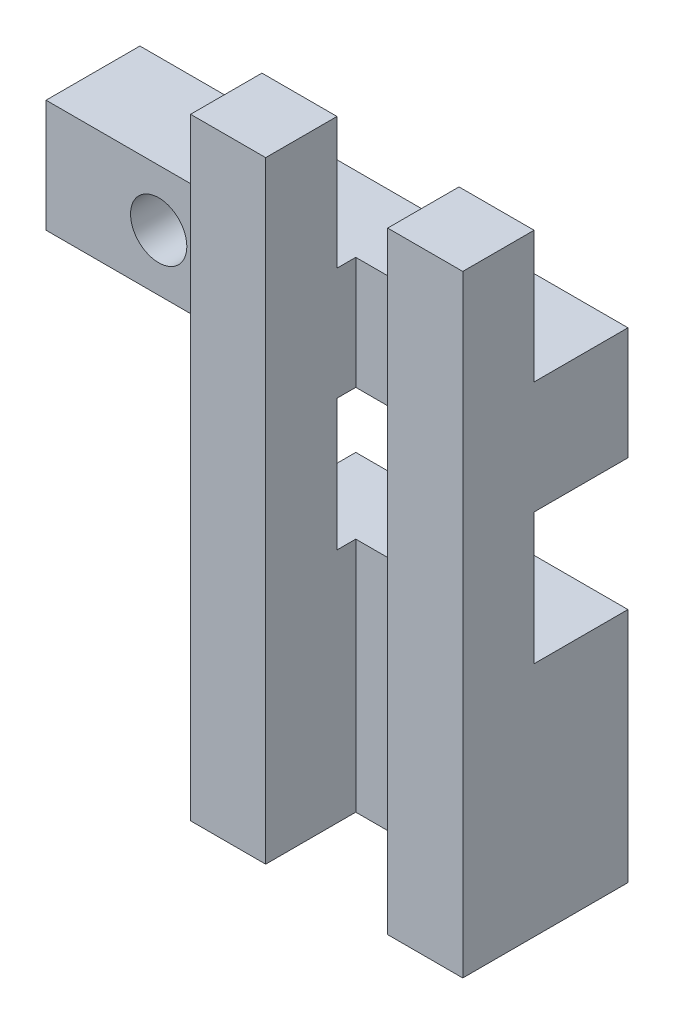
ISO-10303-21;
HEADER;
FILE_DESCRIPTION(('STEP AP214'),'2;1');
FILE_NAME('part.step','',(''),(''),'','','');
FILE_SCHEMA(('AUTOMOTIVE_DESIGN { 1 0 10303 214 1 1 1 1 }'));
ENDSEC;
DATA;
#1=APPLICATION_CONTEXT('core data for automotive mechanical design processes');
#2=APPLICATION_PROTOCOL_DEFINITION('international standard','automotive_design',2000,#1);
#3=PRODUCT_CONTEXT('',#1,'mechanical');
#4=PRODUCT('Part','Part','',(#3));
#5=PRODUCT_RELATED_PRODUCT_CATEGORY('part','',(#4));
#6=PRODUCT_DEFINITION_FORMATION('','',#4);
#7=PRODUCT_DEFINITION_CONTEXT('part definition',#1,'design');
#8=PRODUCT_DEFINITION('design','',#6,#7);
#9=PRODUCT_DEFINITION_SHAPE('','',#8);
#10=(LENGTH_UNIT() NAMED_UNIT(*) SI_UNIT(.MILLI.,.METRE.));
#11=(NAMED_UNIT(*) PLANE_ANGLE_UNIT() SI_UNIT($,.RADIAN.));
#12=(NAMED_UNIT(*) SI_UNIT($,.STERADIAN.) SOLID_ANGLE_UNIT());
#13=UNCERTAINTY_MEASURE_WITH_UNIT(LENGTH_MEASURE(1.E-05),#10,'distance_accuracy_value','');
#14=(GEOMETRIC_REPRESENTATION_CONTEXT(3) GLOBAL_UNCERTAINTY_ASSIGNED_CONTEXT((#13)) GLOBAL_UNIT_ASSIGNED_CONTEXT((#10,
#11,#12)) REPRESENTATION_CONTEXT('',''));
#15=CARTESIAN_POINT('',(0.,0.,0.));
#16=DIRECTION('',(0.,0.,1.));
#17=DIRECTION('',(1.,0.,0.));
#18=AXIS2_PLACEMENT_3D('',#15,#16,#17);
#19=CARTESIAN_POINT('',(0.,0.,5.));
#20=DIRECTION('',(0.,0.,-1.));
#21=DIRECTION('',(-1.,0.,0.));
#22=AXIS2_PLACEMENT_3D('',#19,#20,#21);
#23=PLANE('',#22);
#24=DIRECTION('',(0.,1.,0.));
#25=VECTOR('',#24,1.);
#26=CARTESIAN_POINT('',(26.,7.,5.));
#27=LINE('',#26,#25);
#28=CARTESIAN_POINT('',(26.,-13.,5.));
#29=VERTEX_POINT('',#28);
#30=CARTESIAN_POINT('',(26.,-6.,5.));
#31=VERTEX_POINT('',#30);
#32=EDGE_CURVE('E290',#29,#31,#27,.T.);
#33=ORIENTED_EDGE('',*,*,#32,.F.);
#34=DIRECTION('',(1.,0.,0.));
#35=VECTOR('',#34,1.);
#36=CARTESIAN_POINT('',(26.,-13.,5.));
#37=LINE('',#36,#35);
#38=CARTESIAN_POINT('',(22.,-13.,5.));
#39=VERTEX_POINT('',#38);
#40=EDGE_CURVE('E216',#39,#29,#37,.T.);
#41=ORIENTED_EDGE('',*,*,#40,.F.);
#42=DIRECTION('',(0.,-1.,0.));
#43=VECTOR('',#42,1.);
#44=CARTESIAN_POINT('',(22.,7.,5.));
#45=LINE('',#44,#43);
#46=CARTESIAN_POINT('',(22.,-6.,5.));
#47=VERTEX_POINT('',#46);
#48=EDGE_CURVE('E294',#47,#39,#45,.T.);
#49=ORIENTED_EDGE('',*,*,#48,.F.);
#50=DIRECTION('',(1.,0.,0.));
#51=VECTOR('',#50,1.);
#52=CARTESIAN_POINT('',(0.,-6.,5.));
#53=LINE('',#52,#51);
#54=EDGE_CURVE('E314',#47,#31,#53,.T.);
#55=ORIENTED_EDGE('',*,*,#54,.T.);
#56=EDGE_LOOP('',(#33,#41,#49,#55));
#57=FACE_BOUND('',#56,.T.);
#58=ADVANCED_FACE('F41',(#57),#23,.T.);
#59=CARTESIAN_POINT('',(0.,0.,5.));
#60=DIRECTION('',(0.,0.,-1.));
#61=DIRECTION('',(-1.,0.,0.));
#62=AXIS2_PLACEMENT_3D('',#59,#60,#61);
#63=PLANE('',#62);
#64=DIRECTION('',(0.,1.,0.));
#65=VECTOR('',#64,1.);
#66=CARTESIAN_POINT('',(15.5,7.,5.));
#67=LINE('',#66,#65);
#68=CARTESIAN_POINT('',(15.5,-13.,5.));
#69=VERTEX_POINT('',#68);
#70=CARTESIAN_POINT('',(15.5,-6.,5.));
#71=VERTEX_POINT('',#70);
#72=EDGE_CURVE('E269',#69,#71,#67,.T.);
#73=ORIENTED_EDGE('',*,*,#72,.F.);
#74=CARTESIAN_POINT('',(11.5,-13.,5.));
#75=VERTEX_POINT('',#74);
#76=EDGE_CURVE('E222',#75,#69,#37,.T.);
#77=ORIENTED_EDGE('',*,*,#76,.F.);
#78=DIRECTION('',(0.,-1.,0.));
#79=VECTOR('',#78,1.);
#80=CARTESIAN_POINT('',(11.5,7.,5.));
#81=LINE('',#80,#79);
#82=CARTESIAN_POINT('',(11.5,-6.,5.));
#83=VERTEX_POINT('',#82);
#84=EDGE_CURVE('E266',#83,#75,#81,.T.);
#85=ORIENTED_EDGE('',*,*,#84,.F.);
#86=DIRECTION('',(-1.,0.,0.));
#87=VECTOR('',#86,1.);
#88=CARTESIAN_POINT('',(0.,-6.,5.));
#89=LINE('',#88,#87);
#90=EDGE_CURVE('E64',#71,#83,#89,.T.);
#91=ORIENTED_EDGE('',*,*,#90,.F.);
#92=EDGE_LOOP('',(#73,#77,#85,#91));
#93=FACE_BOUND('',#92,.T.);
#94=ADVANCED_FACE('F400',(#93),#63,.T.);
#95=CARTESIAN_POINT('',(0.,0.,5.));
#96=DIRECTION('',(0.,0.,1.));
#97=DIRECTION('',(1.,0.,0.));
#98=AXIS2_PLACEMENT_3D('',#95,#96,#97);
#99=PLANE('',#98);
#100=CARTESIAN_POINT('',(6.,-3.,5.));
#101=DIRECTION('',(0.,0.,1.));
#102=DIRECTION('',(1.,0.,0.));
#103=AXIS2_PLACEMENT_3D('',#100,#101,#102);
#104=CIRCLE('',#103,1.5);
#105=CARTESIAN_POINT('',(7.5,-3.,5.));
#106=VERTEX_POINT('',#105);
#107=EDGE_CURVE('E305',#106,#106,#104,.T.);
#108=ORIENTED_EDGE('',*,*,#107,.F.);
#109=EDGE_LOOP('',(#108));
#110=FACE_BOUND('',#109,.T.);
#111=CARTESIAN_POINT('',(0.,-6.,5.));
#112=VERTEX_POINT('',#111);
#113=EDGE_CURVE('E316',#112,#83,#53,.T.);
#114=ORIENTED_EDGE('',*,*,#113,.T.);
#115=CARTESIAN_POINT('',(11.5,0.,5.));
#116=VERTEX_POINT('',#115);
#117=EDGE_CURVE('E265',#116,#83,#81,.T.);
#118=ORIENTED_EDGE('',*,*,#117,.F.);
#119=DIRECTION('',(-1.,0.,0.));
#120=VECTOR('',#119,1.);
#121=CARTESIAN_POINT('',(0.,0.,5.));
#122=LINE('',#121,#120);
#123=CARTESIAN_POINT('',(0.,0.,5.));
#124=VERTEX_POINT('',#123);
#125=EDGE_CURVE('E318',#116,#124,#122,.T.);
#126=ORIENTED_EDGE('',*,*,#125,.T.);
#127=DIRECTION('',(0.,-1.,0.));
#128=VECTOR('',#127,1.);
#129=CARTESIAN_POINT('',(0.,0.,5.));
#130=LINE('',#129,#128);
#131=EDGE_CURVE('E311',#124,#112,#130,.T.);
#132=ORIENTED_EDGE('',*,*,#131,.T.);
#133=EDGE_LOOP('',(#114,#118,#126,#132));
#134=FACE_BOUND('',#133,.T.);
#135=ADVANCED_FACE('F410',(#110,#134),#99,.T.);
#136=CARTESIAN_POINT('',(0.,0.,0.));
#137=DIRECTION('',(0.,0.,1.));
#138=DIRECTION('',(1.,0.,0.));
#139=AXIS2_PLACEMENT_3D('',#136,#137,#138);
#140=PLANE('',#139);
#141=DIRECTION('',(0.,-1.,0.));
#142=VECTOR('',#141,1.);
#143=CARTESIAN_POINT('',(0.,0.,0.));
#144=LINE('',#143,#142);
#145=CARTESIAN_POINT('',(0.,0.,0.));
#146=VERTEX_POINT('',#145);
#147=CARTESIAN_POINT('',(0.,-6.,0.));
#148=VERTEX_POINT('',#147);
#149=EDGE_CURVE('E308',#146,#148,#144,.T.);
#150=ORIENTED_EDGE('',*,*,#149,.F.);
#151=DIRECTION('',(-1.,0.,0.));
#152=VECTOR('',#151,1.);
#153=CARTESIAN_POINT('',(0.,0.,0.));
#154=LINE('',#153,#152);
#155=CARTESIAN_POINT('',(26.,0.,0.));
#156=VERTEX_POINT('',#155);
#157=EDGE_CURVE('E315',#156,#146,#154,.T.);
#158=ORIENTED_EDGE('',*,*,#157,.F.);
#159=DIRECTION('',(0.,1.,0.));
#160=VECTOR('',#159,1.);
#161=CARTESIAN_POINT('',(26.,0.,0.));
#162=LINE('',#161,#160);
#163=CARTESIAN_POINT('',(26.,-6.,0.));
#164=VERTEX_POINT('',#163);
#165=EDGE_CURVE('E328',#164,#156,#162,.T.);
#166=ORIENTED_EDGE('',*,*,#165,.F.);
#167=DIRECTION('',(1.,0.,0.));
#168=VECTOR('',#167,1.);
#169=CARTESIAN_POINT('',(0.,-6.,0.));
#170=LINE('',#169,#168);
#171=EDGE_CURVE('E326',#148,#164,#170,.T.);
#172=ORIENTED_EDGE('',*,*,#171,.F.);
#173=EDGE_LOOP('',(#150,#158,#166,#172));
#174=FACE_BOUND('',#173,.T.);
#175=CARTESIAN_POINT('',(6.,-3.,0.));
#176=DIRECTION('',(0.,0.,1.));
#177=DIRECTION('',(1.,0.,0.));
#178=AXIS2_PLACEMENT_3D('',#175,#176,#177);
#179=CIRCLE('',#178,1.5);
#180=CARTESIAN_POINT('',(7.5,-3.,0.));
#181=VERTEX_POINT('',#180);
#182=EDGE_CURVE('E304',#181,#181,#179,.T.);
#183=ORIENTED_EDGE('',*,*,#182,.T.);
#184=EDGE_LOOP('',(#183));
#185=FACE_BOUND('',#184,.T.);
#186=ADVANCED_FACE('F349',(#174,#185),#140,.F.);
#187=CARTESIAN_POINT('',(0.,0.,5.));
#188=DIRECTION('',(1.,0.,0.));
#189=DIRECTION('',(0.,1.,0.));
#190=AXIS2_PLACEMENT_3D('',#187,#188,#189);
#191=PLANE('',#190);
#192=ORIENTED_EDGE('',*,*,#149,.T.);
#193=DIRECTION('',(0.,0.,-1.));
#194=VECTOR('',#193,1.);
#195=CARTESIAN_POINT('',(0.,-6.,5.));
#196=LINE('',#195,#194);
#197=EDGE_CURVE('E49',#112,#148,#196,.T.);
#198=ORIENTED_EDGE('',*,*,#197,.F.);
#199=ORIENTED_EDGE('',*,*,#131,.F.);
#200=DIRECTION('',(0.,0.,-1.));
#201=VECTOR('',#200,1.);
#202=CARTESIAN_POINT('',(0.,0.,5.));
#203=LINE('',#202,#201);
#204=EDGE_CURVE('E322',#124,#146,#203,.T.);
#205=ORIENTED_EDGE('',*,*,#204,.T.);
#206=EDGE_LOOP('',(#192,#198,#199,#205));
#207=FACE_BOUND('',#206,.T.);
#208=ADVANCED_FACE('F43',(#207),#191,.F.);
#209=CARTESIAN_POINT('',(0.,-6.,5.));
#210=DIRECTION('',(0.,1.,0.));
#211=DIRECTION('',(0.,0.,1.));
#212=AXIS2_PLACEMENT_3D('',#209,#210,#211);
#213=PLANE('',#212);
#214=DIRECTION('',(1.,0.,0.));
#215=VECTOR('',#214,1.);
#216=CARTESIAN_POINT('',(15.5,-6.,4.));
#217=LINE('',#216,#215);
#218=CARTESIAN_POINT('',(15.5,-6.,4.));
#219=VERTEX_POINT('',#218);
#220=CARTESIAN_POINT('',(22.,-6.,4.));
#221=VERTEX_POINT('',#220);
#222=EDGE_CURVE('E238',#219,#221,#217,.T.);
#223=ORIENTED_EDGE('',*,*,#222,.F.);
#224=DIRECTION('',(0.,0.,1.));
#225=VECTOR('',#224,1.);
#226=CARTESIAN_POINT('',(15.5,-6.,4.));
#227=LINE('',#226,#225);
#228=EDGE_CURVE('E244',#219,#71,#227,.T.);
#229=ORIENTED_EDGE('',*,*,#228,.T.);
#230=ORIENTED_EDGE('',*,*,#90,.T.);
#231=ORIENTED_EDGE('',*,*,#113,.F.);
#232=ORIENTED_EDGE('',*,*,#197,.T.);
#233=ORIENTED_EDGE('',*,*,#171,.T.);
#234=DIRECTION('',(0.,0.,-1.));
#235=VECTOR('',#234,1.);
#236=CARTESIAN_POINT('',(26.,-6.,5.));
#237=LINE('',#236,#235);
#238=EDGE_CURVE('E336',#31,#164,#237,.T.);
#239=ORIENTED_EDGE('',*,*,#238,.F.);
#240=ORIENTED_EDGE('',*,*,#54,.F.);
#241=DIRECTION('',(0.,0.,1.));
#242=VECTOR('',#241,1.);
#243=CARTESIAN_POINT('',(22.,-6.,4.));
#244=LINE('',#243,#242);
#245=EDGE_CURVE('E245',#221,#47,#244,.T.);
#246=ORIENTED_EDGE('',*,*,#245,.F.);
#247=EDGE_LOOP('',(#223,#229,#230,#231,#232,#233,#239,#240,#246));
#248=FACE_BOUND('',#247,.T.);
#249=ADVANCED_FACE('F341',(#248),#213,.F.);
#250=CARTESIAN_POINT('',(26.,0.,5.));
#251=DIRECTION('',(-1.,0.,0.));
#252=DIRECTION('',(0.,0.,1.));
#253=AXIS2_PLACEMENT_3D('',#250,#251,#252);
#254=PLANE('',#253);
#255=ORIENTED_EDGE('',*,*,#165,.T.);
#256=DIRECTION('',(0.,0.,-1.));
#257=VECTOR('',#256,1.);
#258=CARTESIAN_POINT('',(26.,0.,5.));
#259=LINE('',#258,#257);
#260=CARTESIAN_POINT('',(26.,0.,5.));
#261=VERTEX_POINT('',#260);
#262=EDGE_CURVE('E333',#261,#156,#259,.T.);
#263=ORIENTED_EDGE('',*,*,#262,.F.);
#264=CARTESIAN_POINT('',(26.,7.,5.));
#265=VERTEX_POINT('',#264);
#266=EDGE_CURVE('E278',#261,#265,#27,.T.);
#267=ORIENTED_EDGE('',*,*,#266,.T.);
#268=DIRECTION('',(0.,0.,-1.));
#269=VECTOR('',#268,1.);
#270=CARTESIAN_POINT('',(26.,7.,8.8));
#271=LINE('',#270,#269);
#272=CARTESIAN_POINT('',(26.,7.,8.8));
#273=VERTEX_POINT('',#272);
#274=EDGE_CURVE('E301',#273,#265,#271,.T.);
#275=ORIENTED_EDGE('',*,*,#274,.F.);
#276=DIRECTION('',(0.,1.,0.));
#277=VECTOR('',#276,1.);
#278=CARTESIAN_POINT('',(26.,7.,8.8));
#279=LINE('',#278,#277);
#280=CARTESIAN_POINT('',(26.,-25.6,8.8));
#281=VERTEX_POINT('',#280);
#282=EDGE_CURVE('E279',#281,#273,#279,.T.);
#283=ORIENTED_EDGE('',*,*,#282,.F.);
#284=DIRECTION('',(0.,0.,-1.));
#285=VECTOR('',#284,1.);
#286=CARTESIAN_POINT('',(26.,-25.6,8.8));
#287=LINE('',#286,#285);
#288=CARTESIAN_POINT('',(26.,-25.6,0.));
#289=VERTEX_POINT('',#288);
#290=EDGE_CURVE('E289',#281,#289,#287,.T.);
#291=ORIENTED_EDGE('',*,*,#290,.T.);
#292=DIRECTION('',(0.,-1.,0.));
#293=VECTOR('',#292,1.);
#294=CARTESIAN_POINT('',(26.,-25.6,0.));
#295=LINE('',#294,#293);
#296=CARTESIAN_POINT('',(26.,-13.,0.));
#297=VERTEX_POINT('',#296);
#298=EDGE_CURVE('E218',#297,#289,#295,.T.);
#299=ORIENTED_EDGE('',*,*,#298,.F.);
#300=DIRECTION('',(0.,0.,1.));
#301=VECTOR('',#300,1.);
#302=CARTESIAN_POINT('',(26.,-13.,0.));
#303=LINE('',#302,#301);
#304=EDGE_CURVE('E229',#297,#29,#303,.T.);
#305=ORIENTED_EDGE('',*,*,#304,.T.);
#306=ORIENTED_EDGE('',*,*,#32,.T.);
#307=ORIENTED_EDGE('',*,*,#238,.T.);
#308=EDGE_LOOP('',(#255,#263,#267,#275,#283,#291,#299,#305,#306,#307));
#309=FACE_BOUND('',#308,.T.);
#310=ADVANCED_FACE('F353',(#309),#254,.F.);
#311=CARTESIAN_POINT('',(0.,0.,5.));
#312=DIRECTION('',(0.,-1.,0.));
#313=DIRECTION('',(0.,0.,-1.));
#314=AXIS2_PLACEMENT_3D('',#311,#312,#313);
#315=PLANE('',#314);
#316=CARTESIAN_POINT('',(15.5,0.,5.));
#317=VERTEX_POINT('',#316);
#318=EDGE_CURVE('E323',#317,#116,#122,.T.);
#319=ORIENTED_EDGE('',*,*,#318,.F.);
#320=DIRECTION('',(0.,0.,-1.));
#321=VECTOR('',#320,1.);
#322=CARTESIAN_POINT('',(15.5,0.,5.));
#323=LINE('',#322,#321);
#324=CARTESIAN_POINT('',(15.5,0.,4.));
#325=VERTEX_POINT('',#324);
#326=EDGE_CURVE('E247',#317,#325,#323,.T.);
#327=ORIENTED_EDGE('',*,*,#326,.T.);
#328=DIRECTION('',(-1.,0.,0.));
#329=VECTOR('',#328,1.);
#330=CARTESIAN_POINT('',(0.,0.,4.));
#331=LINE('',#330,#329);
#332=CARTESIAN_POINT('',(22.,0.,4.));
#333=VERTEX_POINT('',#332);
#334=EDGE_CURVE('E11',#333,#325,#331,.T.);
#335=ORIENTED_EDGE('',*,*,#334,.F.);
#336=DIRECTION('',(0.,0.,1.));
#337=VECTOR('',#336,1.);
#338=CARTESIAN_POINT('',(22.,0.,5.));
#339=LINE('',#338,#337);
#340=CARTESIAN_POINT('',(22.,0.,5.));
#341=VERTEX_POINT('',#340);
#342=EDGE_CURVE('E251',#333,#341,#339,.T.);
#343=ORIENTED_EDGE('',*,*,#342,.T.);
#344=EDGE_CURVE('E319',#261,#341,#122,.T.);
#345=ORIENTED_EDGE('',*,*,#344,.F.);
#346=ORIENTED_EDGE('',*,*,#262,.T.);
#347=ORIENTED_EDGE('',*,*,#157,.T.);
#348=ORIENTED_EDGE('',*,*,#204,.F.);
#349=ORIENTED_EDGE('',*,*,#125,.F.);
#350=EDGE_LOOP('',(#319,#327,#335,#343,#345,#346,#347,#348,#349));
#351=FACE_BOUND('',#350,.T.);
#352=ADVANCED_FACE('F357',(#351),#315,.F.);
#353=CARTESIAN_POINT('',(6.,-3.,5.));
#354=DIRECTION('',(0.,0.,-1.));
#355=DIRECTION('',(-1.,0.,0.));
#356=AXIS2_PLACEMENT_3D('',#353,#354,#355);
#357=CYLINDRICAL_SURFACE('',#356,1.5);
#358=ORIENTED_EDGE('',*,*,#107,.T.);
#359=EDGE_LOOP('',(#358));
#360=FACE_BOUND('',#359,.T.);
#361=ORIENTED_EDGE('',*,*,#182,.F.);
#362=EDGE_LOOP('',(#361));
#363=FACE_BOUND('',#362,.T.);
#364=ADVANCED_FACE('F458',(#360,#363),#357,.F.);
#365=CARTESIAN_POINT('',(26.,7.,8.8));
#366=DIRECTION('',(0.,-1.,0.));
#367=DIRECTION('',(1.,0.,0.));
#368=AXIS2_PLACEMENT_3D('',#365,#366,#367);
#369=PLANE('',#368);
#370=DIRECTION('',(-1.,0.,0.));
#371=VECTOR('',#370,1.);
#372=CARTESIAN_POINT('',(26.,7.,5.));
#373=LINE('',#372,#371);
#374=CARTESIAN_POINT('',(22.,7.,5.));
#375=VERTEX_POINT('',#374);
#376=EDGE_CURVE('E292',#265,#375,#373,.T.);
#377=ORIENTED_EDGE('',*,*,#376,.T.);
#378=DIRECTION('',(0.,0.,-1.));
#379=VECTOR('',#378,1.);
#380=CARTESIAN_POINT('',(22.,7.,8.8));
#381=LINE('',#380,#379);
#382=CARTESIAN_POINT('',(22.,7.,8.8));
#383=VERTEX_POINT('',#382);
#384=EDGE_CURVE('E298',#383,#375,#381,.T.);
#385=ORIENTED_EDGE('',*,*,#384,.F.);
#386=DIRECTION('',(-1.,0.,0.));
#387=VECTOR('',#386,1.);
#388=CARTESIAN_POINT('',(26.,7.,8.8));
#389=LINE('',#388,#387);
#390=EDGE_CURVE('E282',#273,#383,#389,.T.);
#391=ORIENTED_EDGE('',*,*,#390,.F.);
#392=ORIENTED_EDGE('',*,*,#274,.T.);
#393=EDGE_LOOP('',(#377,#385,#391,#392));
#394=FACE_BOUND('',#393,.T.);
#395=ADVANCED_FACE('F367',(#394),#369,.F.);
#396=CARTESIAN_POINT('',(22.,7.,8.8));
#397=DIRECTION('',(1.,0.,0.));
#398=DIRECTION('',(0.,1.,0.));
#399=AXIS2_PLACEMENT_3D('',#396,#397,#398);
#400=PLANE('',#399);
#401=EDGE_CURVE('E283',#375,#341,#45,.T.);
#402=ORIENTED_EDGE('',*,*,#401,.T.);
#403=ORIENTED_EDGE('',*,*,#342,.F.);
#404=DIRECTION('',(0.,1.,0.));
#405=VECTOR('',#404,1.);
#406=CARTESIAN_POINT('',(22.,0.499999999999992,4.));
#407=LINE('',#406,#405);
#408=EDGE_CURVE('E241',#221,#333,#407,.T.);
#409=ORIENTED_EDGE('',*,*,#408,.F.);
#410=ORIENTED_EDGE('',*,*,#245,.T.);
#411=ORIENTED_EDGE('',*,*,#48,.T.);
#412=DIRECTION('',(0.,0.,1.));
#413=VECTOR('',#412,1.);
#414=CARTESIAN_POINT('',(22.,-13.,4.));
#415=LINE('',#414,#413);
#416=CARTESIAN_POINT('',(22.,-13.,4.));
#417=VERTEX_POINT('',#416);
#418=EDGE_CURVE('E213',#417,#39,#415,.T.);
#419=ORIENTED_EDGE('',*,*,#418,.F.);
#420=DIRECTION('',(0.,1.,0.));
#421=VECTOR('',#420,1.);
#422=CARTESIAN_POINT('',(22.,-13.,4.));
#423=LINE('',#422,#421);
#424=CARTESIAN_POINT('',(22.,-25.6,4.));
#425=VERTEX_POINT('',#424);
#426=EDGE_CURVE('E56',#425,#417,#423,.T.);
#427=ORIENTED_EDGE('',*,*,#426,.F.);
#428=DIRECTION('',(0.,0.,-1.));
#429=VECTOR('',#428,1.);
#430=CARTESIAN_POINT('',(22.,-25.6,8.8));
#431=LINE('',#430,#429);
#432=CARTESIAN_POINT('',(22.,-25.6,8.8));
#433=VERTEX_POINT('',#432);
#434=EDGE_CURVE('E208',#433,#425,#431,.T.);
#435=ORIENTED_EDGE('',*,*,#434,.F.);
#436=DIRECTION('',(0.,-1.,0.));
#437=VECTOR('',#436,1.);
#438=CARTESIAN_POINT('',(22.,7.,8.8));
#439=LINE('',#438,#437);
#440=EDGE_CURVE('E285',#383,#433,#439,.T.);
#441=ORIENTED_EDGE('',*,*,#440,.F.);
#442=ORIENTED_EDGE('',*,*,#384,.T.);
#443=EDGE_LOOP('',(#402,#403,#409,#410,#411,#419,#427,#435,#441,#442));
#444=FACE_BOUND('',#443,.T.);
#445=ADVANCED_FACE('F390',(#444),#400,.F.);
#446=CARTESIAN_POINT('',(26.,-25.6,8.8));
#447=DIRECTION('',(0.,1.,0.));
#448=DIRECTION('',(0.,0.,1.));
#449=AXIS2_PLACEMENT_3D('',#446,#447,#448);
#450=PLANE('',#449);
#451=DIRECTION('',(1.,0.,0.));
#452=VECTOR('',#451,1.);
#453=CARTESIAN_POINT('',(15.5,-25.6,4.));
#454=LINE('',#453,#452);
#455=CARTESIAN_POINT('',(15.5,-25.6,4.));
#456=VERTEX_POINT('',#455);
#457=EDGE_CURVE('E200',#456,#425,#454,.T.);
#458=ORIENTED_EDGE('',*,*,#457,.F.);
#459=DIRECTION('',(0.,0.,-1.));
#460=VECTOR('',#459,1.);
#461=CARTESIAN_POINT('',(15.5,-25.6,8.8));
#462=LINE('',#461,#460);
#463=CARTESIAN_POINT('',(15.5,-25.6,8.8));
#464=VERTEX_POINT('',#463);
#465=EDGE_CURVE('E186',#464,#456,#462,.T.);
#466=ORIENTED_EDGE('',*,*,#465,.F.);
#467=DIRECTION('',(1.,0.,0.));
#468=VECTOR('',#467,1.);
#469=CARTESIAN_POINT('',(15.5,-25.6,8.8));
#470=LINE('',#469,#468);
#471=CARTESIAN_POINT('',(11.5,-25.6,8.8));
#472=VERTEX_POINT('',#471);
#473=EDGE_CURVE('E196',#472,#464,#470,.T.);
#474=ORIENTED_EDGE('',*,*,#473,.F.);
#475=DIRECTION('',(0.,0.,-1.));
#476=VECTOR('',#475,1.);
#477=CARTESIAN_POINT('',(11.5,-25.6,8.8));
#478=LINE('',#477,#476);
#479=CARTESIAN_POINT('',(11.5,-25.6,0.));
#480=VERTEX_POINT('',#479);
#481=EDGE_CURVE('E197',#472,#480,#478,.T.);
#482=ORIENTED_EDGE('',*,*,#481,.T.);
#483=DIRECTION('',(-1.,0.,0.));
#484=VECTOR('',#483,1.);
#485=CARTESIAN_POINT('',(26.,-25.6,0.));
#486=LINE('',#485,#484);
#487=EDGE_CURVE('E221',#289,#480,#486,.T.);
#488=ORIENTED_EDGE('',*,*,#487,.F.);
#489=ORIENTED_EDGE('',*,*,#290,.F.);
#490=DIRECTION('',(1.,0.,0.));
#491=VECTOR('',#490,1.);
#492=CARTESIAN_POINT('',(26.,-25.6,8.8));
#493=LINE('',#492,#491);
#494=EDGE_CURVE('E287',#433,#281,#493,.T.);
#495=ORIENTED_EDGE('',*,*,#494,.F.);
#496=ORIENTED_EDGE('',*,*,#434,.T.);
#497=EDGE_LOOP('',(#458,#466,#474,#482,#488,#489,#495,#496));
#498=FACE_BOUND('',#497,.T.);
#499=ADVANCED_FACE('F205',(#498),#450,.F.);
#500=CARTESIAN_POINT('',(0.,0.,8.8));
#501=DIRECTION('',(0.,0.,-1.));
#502=DIRECTION('',(-1.,0.,0.));
#503=AXIS2_PLACEMENT_3D('',#500,#501,#502);
#504=PLANE('',#503);
#505=ORIENTED_EDGE('',*,*,#282,.T.);
#506=ORIENTED_EDGE('',*,*,#390,.T.);
#507=ORIENTED_EDGE('',*,*,#440,.T.);
#508=ORIENTED_EDGE('',*,*,#494,.T.);
#509=EDGE_LOOP('',(#505,#506,#507,#508));
#510=FACE_BOUND('',#509,.T.);
#511=ADVANCED_FACE('F371',(#510),#504,.F.);
#512=ORIENTED_EDGE('',*,*,#266,.F.);
#513=ORIENTED_EDGE('',*,*,#344,.T.);
#514=ORIENTED_EDGE('',*,*,#401,.F.);
#515=ORIENTED_EDGE('',*,*,#376,.F.);
#516=EDGE_LOOP('',(#512,#513,#514,#515));
#517=FACE_BOUND('',#516,.T.);
#518=ADVANCED_FACE('F363',(#517),#23,.T.);
#519=ORIENTED_EDGE('',*,*,#318,.T.);
#520=CARTESIAN_POINT('',(11.5,7.,5.));
#521=VERTEX_POINT('',#520);
#522=EDGE_CURVE('E261',#521,#116,#81,.T.);
#523=ORIENTED_EDGE('',*,*,#522,.F.);
#524=DIRECTION('',(-1.,0.,0.));
#525=VECTOR('',#524,1.);
#526=CARTESIAN_POINT('',(15.5,7.,5.));
#527=LINE('',#526,#525);
#528=CARTESIAN_POINT('',(15.5,7.,5.));
#529=VERTEX_POINT('',#528);
#530=EDGE_CURVE('E264',#529,#521,#527,.T.);
#531=ORIENTED_EDGE('',*,*,#530,.F.);
#532=EDGE_CURVE('E268',#317,#529,#67,.T.);
#533=ORIENTED_EDGE('',*,*,#532,.F.);
#534=EDGE_LOOP('',(#519,#523,#531,#533));
#535=FACE_BOUND('',#534,.T.);
#536=ADVANCED_FACE('F413',(#535),#63,.T.);
#537=CARTESIAN_POINT('',(15.5,7.,8.8));
#538=DIRECTION('',(-1.,0.,0.));
#539=DIRECTION('',(0.,-1.,0.));
#540=AXIS2_PLACEMENT_3D('',#537,#538,#539);
#541=PLANE('',#540);
#542=ORIENTED_EDGE('',*,*,#465,.T.);
#543=DIRECTION('',(0.,-1.,0.));
#544=VECTOR('',#543,1.);
#545=CARTESIAN_POINT('',(15.5,-13.,4.));
#546=LINE('',#545,#544);
#547=CARTESIAN_POINT('',(15.5,-13.,4.));
#548=VERTEX_POINT('',#547);
#549=EDGE_CURVE('E189',#548,#456,#546,.T.);
#550=ORIENTED_EDGE('',*,*,#549,.F.);
#551=DIRECTION('',(0.,0.,1.));
#552=VECTOR('',#551,1.);
#553=CARTESIAN_POINT('',(15.5,-13.,4.));
#554=LINE('',#553,#552);
#555=EDGE_CURVE('E214',#548,#69,#554,.T.);
#556=ORIENTED_EDGE('',*,*,#555,.T.);
#557=ORIENTED_EDGE('',*,*,#72,.T.);
#558=ORIENTED_EDGE('',*,*,#228,.F.);
#559=DIRECTION('',(0.,-1.,0.));
#560=VECTOR('',#559,1.);
#561=CARTESIAN_POINT('',(15.5,0.499999999999992,4.));
#562=LINE('',#561,#560);
#563=EDGE_CURVE('E236',#325,#219,#562,.T.);
#564=ORIENTED_EDGE('',*,*,#563,.F.);
#565=ORIENTED_EDGE('',*,*,#326,.F.);
#566=ORIENTED_EDGE('',*,*,#532,.T.);
#567=DIRECTION('',(0.,0.,-1.));
#568=VECTOR('',#567,1.);
#569=CARTESIAN_POINT('',(15.5,7.,8.8));
#570=LINE('',#569,#568);
#571=CARTESIAN_POINT('',(15.5,7.,8.8));
#572=VERTEX_POINT('',#571);
#573=EDGE_CURVE('E254',#572,#529,#570,.T.);
#574=ORIENTED_EDGE('',*,*,#573,.F.);
#575=DIRECTION('',(0.,1.,0.));
#576=VECTOR('',#575,1.);
#577=CARTESIAN_POINT('',(15.5,7.,8.8));
#578=LINE('',#577,#576);
#579=EDGE_CURVE('E192',#464,#572,#578,.T.);
#580=ORIENTED_EDGE('',*,*,#579,.F.);
#581=EDGE_LOOP('',(#542,#550,#556,#557,#558,#564,#565,#566,#574,#580));
#582=FACE_BOUND('',#581,.T.);
#583=ADVANCED_FACE('F188',(#582),#541,.F.);
#584=CARTESIAN_POINT('',(15.5,7.,8.8));
#585=DIRECTION('',(0.,-1.,0.));
#586=DIRECTION('',(1.,0.,0.));
#587=AXIS2_PLACEMENT_3D('',#584,#585,#586);
#588=PLANE('',#587);
#589=ORIENTED_EDGE('',*,*,#530,.T.);
#590=DIRECTION('',(0.,0.,-1.));
#591=VECTOR('',#590,1.);
#592=CARTESIAN_POINT('',(11.5,7.,8.8));
#593=LINE('',#592,#591);
#594=CARTESIAN_POINT('',(11.5,7.,8.8));
#595=VERTEX_POINT('',#594);
#596=EDGE_CURVE('E257',#595,#521,#593,.T.);
#597=ORIENTED_EDGE('',*,*,#596,.F.);
#598=DIRECTION('',(-1.,0.,0.));
#599=VECTOR('',#598,1.);
#600=CARTESIAN_POINT('',(15.5,7.,8.8));
#601=LINE('',#600,#599);
#602=EDGE_CURVE('E274',#572,#595,#601,.T.);
#603=ORIENTED_EDGE('',*,*,#602,.F.);
#604=ORIENTED_EDGE('',*,*,#573,.T.);
#605=EDGE_LOOP('',(#589,#597,#603,#604));
#606=FACE_BOUND('',#605,.T.);
#607=ADVANCED_FACE('F417',(#606),#588,.F.);
#608=CARTESIAN_POINT('',(11.5,7.,8.8));
#609=DIRECTION('',(1.,0.,0.));
#610=DIRECTION('',(0.,1.,0.));
#611=AXIS2_PLACEMENT_3D('',#608,#609,#610);
#612=PLANE('',#611);
#613=ORIENTED_EDGE('',*,*,#522,.T.);
#614=ORIENTED_EDGE('',*,*,#117,.T.);
#615=ORIENTED_EDGE('',*,*,#84,.T.);
#616=DIRECTION('',(0.,0.,1.));
#617=VECTOR('',#616,1.);
#618=CARTESIAN_POINT('',(11.5,-13.,0.));
#619=LINE('',#618,#617);
#620=CARTESIAN_POINT('',(11.5,-13.,0.));
#621=VERTEX_POINT('',#620);
#622=EDGE_CURVE('E234',#621,#75,#619,.T.);
#623=ORIENTED_EDGE('',*,*,#622,.F.);
#624=DIRECTION('',(0.,1.,0.));
#625=VECTOR('',#624,1.);
#626=CARTESIAN_POINT('',(11.5,-25.6,0.));
#627=LINE('',#626,#625);
#628=EDGE_CURVE('E225',#480,#621,#627,.T.);
#629=ORIENTED_EDGE('',*,*,#628,.F.);
#630=ORIENTED_EDGE('',*,*,#481,.F.);
#631=DIRECTION('',(0.,-1.,0.));
#632=VECTOR('',#631,1.);
#633=CARTESIAN_POINT('',(11.5,7.,8.8));
#634=LINE('',#633,#632);
#635=EDGE_CURVE('E272',#595,#472,#634,.T.);
#636=ORIENTED_EDGE('',*,*,#635,.F.);
#637=ORIENTED_EDGE('',*,*,#596,.T.);
#638=EDGE_LOOP('',(#613,#614,#615,#623,#629,#630,#636,#637));
#639=FACE_BOUND('',#638,.T.);
#640=ADVANCED_FACE('F406',(#639),#612,.F.);
#641=CARTESIAN_POINT('',(0.,0.,8.8));
#642=DIRECTION('',(0.,0.,-1.));
#643=DIRECTION('',(-1.,0.,0.));
#644=AXIS2_PLACEMENT_3D('',#641,#642,#643);
#645=PLANE('',#644);
#646=ORIENTED_EDGE('',*,*,#579,.T.);
#647=ORIENTED_EDGE('',*,*,#602,.T.);
#648=ORIENTED_EDGE('',*,*,#635,.T.);
#649=ORIENTED_EDGE('',*,*,#473,.T.);
#650=EDGE_LOOP('',(#646,#647,#648,#649));
#651=FACE_BOUND('',#650,.T.);
#652=ADVANCED_FACE('F420',(#651),#645,.F.);
#653=CARTESIAN_POINT('',(0.,0.,4.));
#654=DIRECTION('',(0.,0.,1.));
#655=DIRECTION('',(1.,0.,0.));
#656=AXIS2_PLACEMENT_3D('',#653,#654,#655);
#657=PLANE('',#656);
#658=ORIENTED_EDGE('',*,*,#334,.T.);
#659=ORIENTED_EDGE('',*,*,#563,.T.);
#660=ORIENTED_EDGE('',*,*,#222,.T.);
#661=ORIENTED_EDGE('',*,*,#408,.T.);
#662=EDGE_LOOP('',(#658,#659,#660,#661));
#663=FACE_BOUND('',#662,.T.);
#664=ADVANCED_FACE('F395',(#663),#657,.T.);
#665=CARTESIAN_POINT('',(26.,-13.,0.));
#666=DIRECTION('',(0.,-1.,0.));
#667=DIRECTION('',(0.,0.,-1.));
#668=AXIS2_PLACEMENT_3D('',#665,#666,#667);
#669=PLANE('',#668);
#670=ORIENTED_EDGE('',*,*,#76,.T.);
#671=ORIENTED_EDGE('',*,*,#555,.F.);
#672=DIRECTION('',(-1.,0.,0.));
#673=VECTOR('',#672,1.);
#674=CARTESIAN_POINT('',(15.5,-13.,4.));
#675=LINE('',#674,#673);
#676=EDGE_CURVE('E202',#417,#548,#675,.T.);
#677=ORIENTED_EDGE('',*,*,#676,.F.);
#678=ORIENTED_EDGE('',*,*,#418,.T.);
#679=ORIENTED_EDGE('',*,*,#40,.T.);
#680=ORIENTED_EDGE('',*,*,#304,.F.);
#681=DIRECTION('',(1.,0.,0.));
#682=VECTOR('',#681,1.);
#683=CARTESIAN_POINT('',(26.,-13.,0.));
#684=LINE('',#683,#682);
#685=EDGE_CURVE('E227',#621,#297,#684,.T.);
#686=ORIENTED_EDGE('',*,*,#685,.F.);
#687=ORIENTED_EDGE('',*,*,#622,.T.);
#688=EDGE_LOOP('',(#670,#671,#677,#678,#679,#680,#686,#687));
#689=FACE_BOUND('',#688,.T.);
#690=ADVANCED_FACE('F383',(#689),#669,.F.);
#691=CARTESIAN_POINT('',(0.,0.,0.));
#692=DIRECTION('',(0.,0.,1.));
#693=DIRECTION('',(1.,0.,0.));
#694=AXIS2_PLACEMENT_3D('',#691,#692,#693);
#695=PLANE('',#694);
#696=ORIENTED_EDGE('',*,*,#298,.T.);
#697=ORIENTED_EDGE('',*,*,#487,.T.);
#698=ORIENTED_EDGE('',*,*,#628,.T.);
#699=ORIENTED_EDGE('',*,*,#685,.T.);
#700=EDGE_LOOP('',(#696,#697,#698,#699));
#701=FACE_BOUND('',#700,.T.);
#702=ADVANCED_FACE('F378',(#701),#695,.F.);
#703=CARTESIAN_POINT('',(0.,0.,4.));
#704=DIRECTION('',(0.,0.,1.));
#705=DIRECTION('',(1.,0.,0.));
#706=AXIS2_PLACEMENT_3D('',#703,#704,#705);
#707=PLANE('',#706);
#708=ORIENTED_EDGE('',*,*,#549,.T.);
#709=ORIENTED_EDGE('',*,*,#457,.T.);
#710=ORIENTED_EDGE('',*,*,#426,.T.);
#711=ORIENTED_EDGE('',*,*,#676,.T.);
#712=EDGE_LOOP('',(#708,#709,#710,#711));
#713=FACE_BOUND('',#712,.T.);
#714=ADVANCED_FACE('F199',(#713),#707,.T.);
#715=CLOSED_SHELL('',(#58,#94,#135,#186,#208,#249,#310,#352,#364,#395,#445,#499,#511,#518,#536,
#583,#607,#640,#652,#664,#690,#702,#714));
#716=MANIFOLD_SOLID_BREP('B2',#715);
#717=ADVANCED_BREP_SHAPE_REPRESENTATION('',(#18,#716),#14);
#718=SHAPE_DEFINITION_REPRESENTATION(#9,#717);
ENDSEC;
END-ISO-10303-21;
